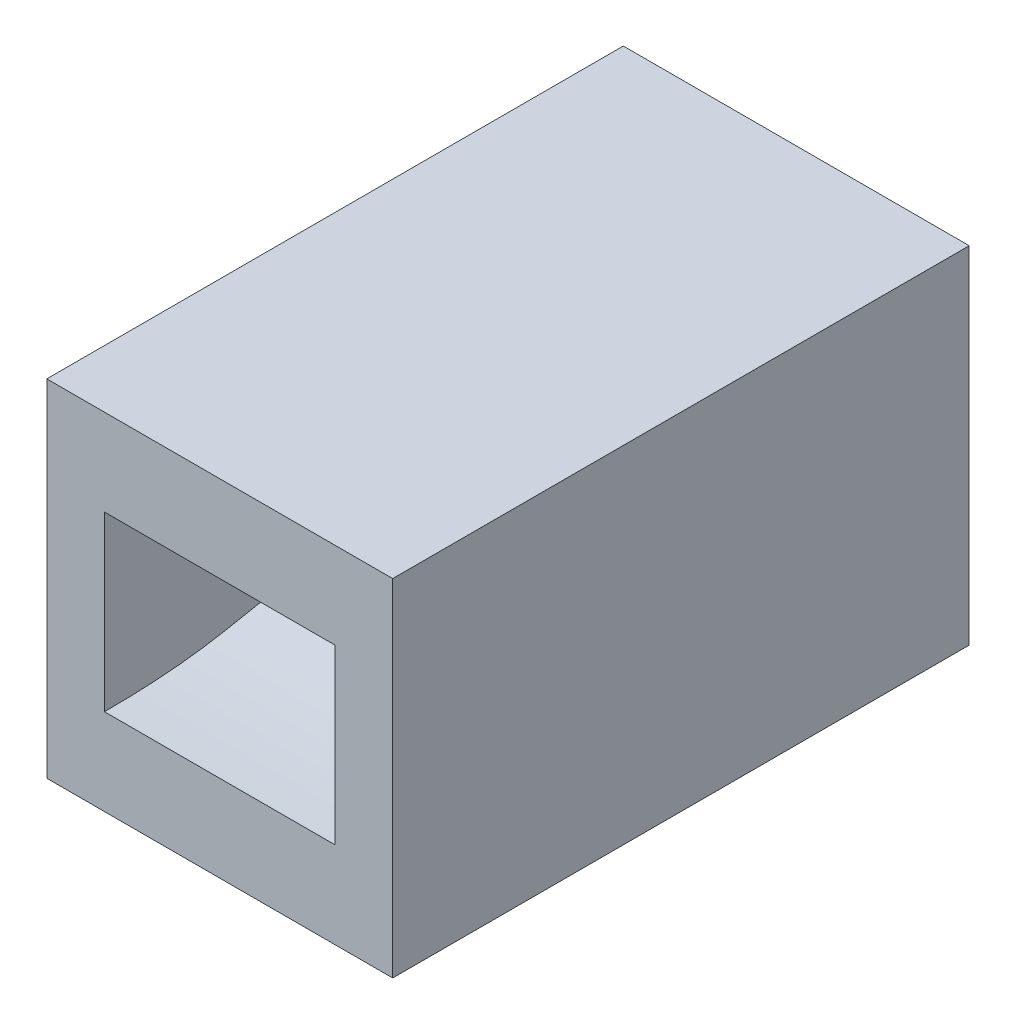
ISO-10303-21;
HEADER;
FILE_DESCRIPTION(('STEP AP214'),'2;1');
FILE_NAME('part.step','',(''),(''),'','','');
FILE_SCHEMA(('AUTOMOTIVE_DESIGN { 1 0 10303 214 1 1 1 1 }'));
ENDSEC;
DATA;
#1=APPLICATION_CONTEXT('core data for automotive mechanical design processes');
#2=APPLICATION_PROTOCOL_DEFINITION('international standard','automotive_design',2000,#1);
#3=PRODUCT_CONTEXT('',#1,'mechanical');
#4=PRODUCT('Part','Part','',(#3));
#5=PRODUCT_RELATED_PRODUCT_CATEGORY('part','',(#4));
#6=PRODUCT_DEFINITION_FORMATION('','',#4);
#7=PRODUCT_DEFINITION_CONTEXT('part definition',#1,'design');
#8=PRODUCT_DEFINITION('design','',#6,#7);
#9=PRODUCT_DEFINITION_SHAPE('','',#8);
#10=(LENGTH_UNIT() NAMED_UNIT(*) SI_UNIT(.MILLI.,.METRE.));
#11=(NAMED_UNIT(*) PLANE_ANGLE_UNIT() SI_UNIT($,.RADIAN.));
#12=(NAMED_UNIT(*) SI_UNIT($,.STERADIAN.) SOLID_ANGLE_UNIT());
#13=UNCERTAINTY_MEASURE_WITH_UNIT(LENGTH_MEASURE(1.E-05),#10,'distance_accuracy_value','');
#14=(GEOMETRIC_REPRESENTATION_CONTEXT(3) GLOBAL_UNCERTAINTY_ASSIGNED_CONTEXT((#13)) GLOBAL_UNIT_ASSIGNED_CONTEXT((#10,
#11,#12)) REPRESENTATION_CONTEXT('',''));
#15=CARTESIAN_POINT('',(0.,0.,0.));
#16=DIRECTION('',(0.,0.,1.));
#17=DIRECTION('',(1.,0.,0.));
#18=AXIS2_PLACEMENT_3D('',#15,#16,#17);
#19=CARTESIAN_POINT('',(30.,30.,0.));
#20=DIRECTION('',(0.,0.,1.));
#21=DIRECTION('',(0.,-1.,0.));
#22=AXIS2_PLACEMENT_3D('',#19,#20,#21);
#23=PLANE('',#22);
#24=DIRECTION('',(0.,1.,0.));
#25=VECTOR('',#24,1.);
#26=CARTESIAN_POINT('',(-30.,30.,0.));
#27=LINE('',#26,#25);
#28=CARTESIAN_POINT('',(-30.,-30.,0.));
#29=VERTEX_POINT('',#28);
#30=CARTESIAN_POINT('',(-30.,30.,0.));
#31=VERTEX_POINT('',#30);
#32=EDGE_CURVE('E210',#29,#31,#27,.T.);
#33=ORIENTED_EDGE('',*,*,#32,.T.);
#34=DIRECTION('',(-1.,0.,0.));
#35=VECTOR('',#34,1.);
#36=CARTESIAN_POINT('',(30.,30.,0.));
#37=LINE('',#36,#35);
#38=CARTESIAN_POINT('',(30.,30.,0.));
#39=VERTEX_POINT('',#38);
#40=EDGE_CURVE('E11',#39,#31,#37,.T.);
#41=ORIENTED_EDGE('',*,*,#40,.F.);
#42=DIRECTION('',(0.,1.,0.));
#43=VECTOR('',#42,1.);
#44=CARTESIAN_POINT('',(30.,30.,0.));
#45=LINE('',#44,#43);
#46=CARTESIAN_POINT('',(30.,-30.,0.));
#47=VERTEX_POINT('',#46);
#48=EDGE_CURVE('E213',#47,#39,#45,.T.);
#49=ORIENTED_EDGE('',*,*,#48,.F.);
#50=DIRECTION('',(-1.,0.,0.));
#51=VECTOR('',#50,1.);
#52=CARTESIAN_POINT('',(30.,-30.,0.));
#53=LINE('',#52,#51);
#54=EDGE_CURVE('E224',#47,#29,#53,.T.);
#55=ORIENTED_EDGE('',*,*,#54,.T.);
#56=EDGE_LOOP('',(#33,#41,#49,#55));
#57=FACE_BOUND('',#56,.T.);
#58=DIRECTION('',(0.,1.,0.));
#59=VECTOR('',#58,1.);
#60=CARTESIAN_POINT('',(-20.,15.,0.));
#61=LINE('',#60,#59);
#62=CARTESIAN_POINT('',(-20.,-15.,0.));
#63=VERTEX_POINT('',#62);
#64=CARTESIAN_POINT('',(-20.,15.,0.));
#65=VERTEX_POINT('',#64);
#66=EDGE_CURVE('E177',#63,#65,#61,.T.);
#67=ORIENTED_EDGE('',*,*,#66,.F.);
#68=DIRECTION('',(1.,0.,0.));
#69=VECTOR('',#68,1.);
#70=CARTESIAN_POINT('',(-20.,-15.,0.));
#71=LINE('',#70,#69);
#72=CARTESIAN_POINT('',(20.,-15.,0.));
#73=VERTEX_POINT('',#72);
#74=EDGE_CURVE('E209',#63,#73,#71,.T.);
#75=ORIENTED_EDGE('',*,*,#74,.T.);
#76=DIRECTION('',(0.,1.,0.));
#77=VECTOR('',#76,1.);
#78=CARTESIAN_POINT('',(20.,15.,0.));
#79=LINE('',#78,#77);
#80=CARTESIAN_POINT('',(20.,15.,0.));
#81=VERTEX_POINT('',#80);
#82=EDGE_CURVE('E197',#73,#81,#79,.T.);
#83=ORIENTED_EDGE('',*,*,#82,.T.);
#84=DIRECTION('',(1.,0.,0.));
#85=VECTOR('',#84,1.);
#86=CARTESIAN_POINT('',(-20.,15.,0.));
#87=LINE('',#86,#85);
#88=EDGE_CURVE('E204',#65,#81,#87,.T.);
#89=ORIENTED_EDGE('',*,*,#88,.F.);
#90=EDGE_LOOP('',(#67,#75,#83,#89));
#91=FACE_BOUND('',#90,.T.);
#92=ADVANCED_FACE('F39',(#57,#91),#23,.F.);
#93=CARTESIAN_POINT('',(30.,30.,0.));
#94=DIRECTION('',(0.,-1.,0.));
#95=DIRECTION('',(0.,0.,-1.));
#96=AXIS2_PLACEMENT_3D('',#93,#94,#95);
#97=PLANE('',#96);
#98=DIRECTION('',(0.,0.,1.));
#99=VECTOR('',#98,1.);
#100=CARTESIAN_POINT('',(-30.,30.,0.));
#101=LINE('',#100,#99);
#102=CARTESIAN_POINT('',(-30.,30.,100.));
#103=VERTEX_POINT('',#102);
#104=EDGE_CURVE('E230',#31,#103,#101,.T.);
#105=ORIENTED_EDGE('',*,*,#104,.T.);
#106=DIRECTION('',(-1.,0.,0.));
#107=VECTOR('',#106,1.);
#108=CARTESIAN_POINT('',(30.,30.,100.));
#109=LINE('',#108,#107);
#110=CARTESIAN_POINT('',(30.,30.,100.));
#111=VERTEX_POINT('',#110);
#112=EDGE_CURVE('E46',#111,#103,#109,.T.);
#113=ORIENTED_EDGE('',*,*,#112,.F.);
#114=DIRECTION('',(0.,0.,1.));
#115=VECTOR('',#114,1.);
#116=CARTESIAN_POINT('',(30.,30.,0.));
#117=LINE('',#116,#115);
#118=EDGE_CURVE('E219',#39,#111,#117,.T.);
#119=ORIENTED_EDGE('',*,*,#118,.F.);
#120=ORIENTED_EDGE('',*,*,#40,.T.);
#121=EDGE_LOOP('',(#105,#113,#119,#120));
#122=FACE_BOUND('',#121,.T.);
#123=ADVANCED_FACE('F257',(#122),#97,.F.);
#124=CARTESIAN_POINT('',(30.,30.,100.));
#125=DIRECTION('',(0.,0.,-1.));
#126=DIRECTION('',(-1.,0.,0.));
#127=AXIS2_PLACEMENT_3D('',#124,#125,#126);
#128=PLANE('',#127);
#129=DIRECTION('',(1.,0.,0.));
#130=VECTOR('',#129,1.);
#131=CARTESIAN_POINT('',(-20.,-15.,100.));
#132=LINE('',#131,#130);
#133=CARTESIAN_POINT('',(-20.,-15.,100.));
#134=VERTEX_POINT('',#133);
#135=CARTESIAN_POINT('',(20.,-15.,100.));
#136=VERTEX_POINT('',#135);
#137=EDGE_CURVE('E52',#134,#136,#132,.T.);
#138=ORIENTED_EDGE('',*,*,#137,.F.);
#139=DIRECTION('',(0.,1.,0.));
#140=VECTOR('',#139,1.);
#141=CARTESIAN_POINT('',(-20.,15.,100.));
#142=LINE('',#141,#140);
#143=CARTESIAN_POINT('',(-20.,15.,100.));
#144=VERTEX_POINT('',#143);
#145=EDGE_CURVE('E134',#134,#144,#142,.T.);
#146=ORIENTED_EDGE('',*,*,#145,.T.);
#147=DIRECTION('',(1.,0.,0.));
#148=VECTOR('',#147,1.);
#149=CARTESIAN_POINT('',(-20.,15.,100.));
#150=LINE('',#149,#148);
#151=CARTESIAN_POINT('',(20.,15.,100.));
#152=VERTEX_POINT('',#151);
#153=EDGE_CURVE('E120',#144,#152,#150,.T.);
#154=ORIENTED_EDGE('',*,*,#153,.T.);
#155=DIRECTION('',(0.,1.,0.));
#156=VECTOR('',#155,1.);
#157=CARTESIAN_POINT('',(20.,15.,100.));
#158=LINE('',#157,#156);
#159=EDGE_CURVE('E337',#136,#152,#158,.T.);
#160=ORIENTED_EDGE('',*,*,#159,.F.);
#161=EDGE_LOOP('',(#138,#146,#154,#160));
#162=FACE_BOUND('',#161,.T.);
#163=DIRECTION('',(0.,-1.,0.));
#164=VECTOR('',#163,1.);
#165=CARTESIAN_POINT('',(-30.,30.,100.));
#166=LINE('',#165,#164);
#167=CARTESIAN_POINT('',(-30.,-30.,100.));
#168=VERTEX_POINT('',#167);
#169=EDGE_CURVE('E227',#103,#168,#166,.T.);
#170=ORIENTED_EDGE('',*,*,#169,.T.);
#171=DIRECTION('',(-1.,0.,0.));
#172=VECTOR('',#171,1.);
#173=CARTESIAN_POINT('',(30.,-30.,100.));
#174=LINE('',#173,#172);
#175=CARTESIAN_POINT('',(30.,-30.,100.));
#176=VERTEX_POINT('',#175);
#177=EDGE_CURVE('E233',#176,#168,#174,.T.);
#178=ORIENTED_EDGE('',*,*,#177,.F.);
#179=DIRECTION('',(0.,-1.,0.));
#180=VECTOR('',#179,1.);
#181=CARTESIAN_POINT('',(30.,30.,100.));
#182=LINE('',#181,#180);
#183=EDGE_CURVE('E221',#111,#176,#182,.T.);
#184=ORIENTED_EDGE('',*,*,#183,.F.);
#185=ORIENTED_EDGE('',*,*,#112,.T.);
#186=EDGE_LOOP('',(#170,#178,#184,#185));
#187=FACE_BOUND('',#186,.T.);
#188=ADVANCED_FACE('F139',(#162,#187),#128,.F.);
#189=CARTESIAN_POINT('',(30.,-30.,0.));
#190=DIRECTION('',(0.,1.,0.));
#191=DIRECTION('',(0.,0.,1.));
#192=AXIS2_PLACEMENT_3D('',#189,#190,#191);
#193=PLANE('',#192);
#194=DIRECTION('',(0.,0.,-1.));
#195=VECTOR('',#194,1.);
#196=CARTESIAN_POINT('',(-30.,-30.,0.));
#197=LINE('',#196,#195);
#198=EDGE_CURVE('E218',#168,#29,#197,.T.);
#199=ORIENTED_EDGE('',*,*,#198,.T.);
#200=ORIENTED_EDGE('',*,*,#54,.F.);
#201=DIRECTION('',(0.,0.,-1.));
#202=VECTOR('',#201,1.);
#203=CARTESIAN_POINT('',(30.,-30.,0.));
#204=LINE('',#203,#202);
#205=EDGE_CURVE('E223',#176,#47,#204,.T.);
#206=ORIENTED_EDGE('',*,*,#205,.F.);
#207=ORIENTED_EDGE('',*,*,#177,.T.);
#208=EDGE_LOOP('',(#199,#200,#206,#207));
#209=FACE_BOUND('',#208,.T.);
#210=ADVANCED_FACE('F247',(#209),#193,.F.);
#211=CARTESIAN_POINT('',(30.,0.,0.));
#212=DIRECTION('',(-1.,0.,0.));
#213=DIRECTION('',(0.,0.,1.));
#214=AXIS2_PLACEMENT_3D('',#211,#212,#213);
#215=PLANE('',#214);
#216=ORIENTED_EDGE('',*,*,#48,.T.);
#217=ORIENTED_EDGE('',*,*,#118,.T.);
#218=ORIENTED_EDGE('',*,*,#183,.T.);
#219=ORIENTED_EDGE('',*,*,#205,.T.);
#220=EDGE_LOOP('',(#216,#217,#218,#219));
#221=FACE_BOUND('',#220,.T.);
#222=ADVANCED_FACE('F258',(#221),#215,.F.);
#223=CARTESIAN_POINT('',(-30.,0.,0.));
#224=DIRECTION('',(-1.,0.,0.));
#225=DIRECTION('',(0.,0.,1.));
#226=AXIS2_PLACEMENT_3D('',#223,#224,#225);
#227=PLANE('',#226);
#228=ORIENTED_EDGE('',*,*,#32,.F.);
#229=ORIENTED_EDGE('',*,*,#198,.F.);
#230=ORIENTED_EDGE('',*,*,#169,.F.);
#231=ORIENTED_EDGE('',*,*,#104,.F.);
#232=EDGE_LOOP('',(#228,#229,#230,#231));
#233=FACE_BOUND('',#232,.T.);
#234=ADVANCED_FACE('F246',(#233),#227,.T.);
#235=CARTESIAN_POINT('',(-20.,15.,0.));
#236=CARTESIAN_POINT('',(-20.,15.,25.));
#237=CARTESIAN_POINT('',(-20.,20.,25.));
#238=CARTESIAN_POINT('',(-20.,20.,50.));
#239=B_SPLINE_CURVE_WITH_KNOTS('',3,(#235,#236,#237,#238),.UNSPECIFIED.,.F.,.F.,(4,4),(0.,1.),.UNSPECIFIED.);
#240=DIRECTION('',(1.,0.,0.));
#241=VECTOR('',#240,1.);
#242=SURFACE_OF_LINEAR_EXTRUSION('',#239,#241);
#243=CARTESIAN_POINT('',(20.,15.,0.));
#244=CARTESIAN_POINT('',(20.,15.,25.));
#245=CARTESIAN_POINT('',(20.,20.,25.));
#246=CARTESIAN_POINT('',(20.,20.,50.));
#247=B_SPLINE_CURVE_WITH_KNOTS('',3,(#243,#244,#245,#246),.UNSPECIFIED.,.F.,.F.,(4,4),(0.,1.),.UNSPECIFIED.);
#248=CARTESIAN_POINT('',(20.,20.,50.));
#249=VERTEX_POINT('',#248);
#250=EDGE_CURVE('E62',#81,#249,#247,.T.);
#251=ORIENTED_EDGE('',*,*,#250,.T.);
#252=DIRECTION('',(1.,0.,0.));
#253=VECTOR('',#252,1.);
#254=CARTESIAN_POINT('',(-20.,20.,50.));
#255=LINE('',#254,#253);
#256=CARTESIAN_POINT('',(-20.,20.,50.));
#257=VERTEX_POINT('',#256);
#258=EDGE_CURVE('E186',#257,#249,#255,.T.);
#259=ORIENTED_EDGE('',*,*,#258,.F.);
#260=EDGE_CURVE('E133',#65,#257,#239,.T.);
#261=ORIENTED_EDGE('',*,*,#260,.F.);
#262=ORIENTED_EDGE('',*,*,#88,.T.);
#263=EDGE_LOOP('',(#251,#259,#261,#262));
#264=FACE_BOUND('',#263,.T.);
#265=ADVANCED_FACE('F170',(#264),#242,.F.);
#266=CARTESIAN_POINT('',(-20.,-10.,50.));
#267=CARTESIAN_POINT('',(-20.,-10.,25.));
#268=CARTESIAN_POINT('',(-20.,-15.,25.));
#269=CARTESIAN_POINT('',(-20.,-15.,0.));
#270=B_SPLINE_CURVE_WITH_KNOTS('',3,(#266,#267,#268,#269),.UNSPECIFIED.,.F.,.F.,(4,4),(0.,1.),.UNSPECIFIED.);
#271=DIRECTION('',(1.,0.,0.));
#272=VECTOR('',#271,1.);
#273=SURFACE_OF_LINEAR_EXTRUSION('',#270,#272);
#274=CARTESIAN_POINT('',(20.,-10.,50.));
#275=CARTESIAN_POINT('',(20.,-10.,25.));
#276=CARTESIAN_POINT('',(20.,-15.,25.));
#277=CARTESIAN_POINT('',(20.,-15.,0.));
#278=B_SPLINE_CURVE_WITH_KNOTS('',3,(#274,#275,#276,#277),.UNSPECIFIED.,.F.,.F.,(4,4),(0.,1.),.UNSPECIFIED.);
#279=CARTESIAN_POINT('',(20.,-10.,50.));
#280=VERTEX_POINT('',#279);
#281=EDGE_CURVE('E195',#280,#73,#278,.T.);
#282=ORIENTED_EDGE('',*,*,#281,.T.);
#283=ORIENTED_EDGE('',*,*,#74,.F.);
#284=CARTESIAN_POINT('',(-20.,-10.,50.));
#285=VERTEX_POINT('',#284);
#286=EDGE_CURVE('E172',#285,#63,#270,.T.);
#287=ORIENTED_EDGE('',*,*,#286,.F.);
#288=DIRECTION('',(1.,0.,0.));
#289=VECTOR('',#288,1.);
#290=CARTESIAN_POINT('',(-20.,-10.,50.));
#291=LINE('',#290,#289);
#292=EDGE_CURVE('E212',#285,#280,#291,.T.);
#293=ORIENTED_EDGE('',*,*,#292,.T.);
#294=EDGE_LOOP('',(#282,#283,#287,#293));
#295=FACE_BOUND('',#294,.T.);
#296=ADVANCED_FACE('F161',(#295),#273,.F.);
#297=CARTESIAN_POINT('',(-20.,17.5,25.));
#298=DIRECTION('',(1.,0.,0.));
#299=DIRECTION('',(0.,0.,-1.));
#300=AXIS2_PLACEMENT_3D('',#297,#298,#299);
#301=PLANE('',#300);
#302=ORIENTED_EDGE('',*,*,#260,.T.);
#303=CARTESIAN_POINT('',(-20.,15.,100.));
#304=CARTESIAN_POINT('',(-20.,15.,75.));
#305=CARTESIAN_POINT('',(-20.,20.,75.));
#306=CARTESIAN_POINT('',(-20.,20.,50.));
#307=B_SPLINE_CURVE_WITH_KNOTS('',3,(#303,#304,#305,#306),.UNSPECIFIED.,.F.,.F.,(4,4),(0.,1.),.UNSPECIFIED.);
#308=EDGE_CURVE('E119',#144,#257,#307,.T.);
#309=ORIENTED_EDGE('',*,*,#308,.F.);
#310=ORIENTED_EDGE('',*,*,#145,.F.);
#311=CARTESIAN_POINT('',(-20.,-10.,50.));
#312=CARTESIAN_POINT('',(-20.,-10.,75.));
#313=CARTESIAN_POINT('',(-20.,-15.,75.));
#314=CARTESIAN_POINT('',(-20.,-15.,100.));
#315=B_SPLINE_CURVE_WITH_KNOTS('',3,(#311,#312,#313,#314),.UNSPECIFIED.,.F.,.F.,(4,4),(0.,1.),.UNSPECIFIED.);
#316=EDGE_CURVE('E126',#285,#134,#315,.T.);
#317=ORIENTED_EDGE('',*,*,#316,.F.);
#318=ORIENTED_EDGE('',*,*,#286,.T.);
#319=ORIENTED_EDGE('',*,*,#66,.T.);
#320=EDGE_LOOP('',(#302,#309,#310,#317,#318,#319));
#321=FACE_BOUND('',#320,.T.);
#322=ADVANCED_FACE('F132',(#321),#301,.T.);
#323=CARTESIAN_POINT('',(20.,17.5,25.));
#324=DIRECTION('',(1.,0.,0.));
#325=DIRECTION('',(0.,0.,-1.));
#326=AXIS2_PLACEMENT_3D('',#323,#324,#325);
#327=PLANE('',#326);
#328=ORIENTED_EDGE('',*,*,#250,.F.);
#329=ORIENTED_EDGE('',*,*,#82,.F.);
#330=ORIENTED_EDGE('',*,*,#281,.F.);
#331=CARTESIAN_POINT('',(20.,-10.,50.));
#332=CARTESIAN_POINT('',(20.,-10.,75.));
#333=CARTESIAN_POINT('',(20.,-15.,75.));
#334=CARTESIAN_POINT('',(20.,-15.,100.));
#335=B_SPLINE_CURVE_WITH_KNOTS('',3,(#331,#332,#333,#334),.UNSPECIFIED.,.F.,.F.,(4,4),(0.,1.),.UNSPECIFIED.);
#336=EDGE_CURVE('E137',#280,#136,#335,.T.);
#337=ORIENTED_EDGE('',*,*,#336,.T.);
#338=ORIENTED_EDGE('',*,*,#159,.T.);
#339=CARTESIAN_POINT('',(20.,15.,100.));
#340=CARTESIAN_POINT('',(20.,15.,75.));
#341=CARTESIAN_POINT('',(20.,20.,75.));
#342=CARTESIAN_POINT('',(20.,20.,50.));
#343=B_SPLINE_CURVE_WITH_KNOTS('',3,(#339,#340,#341,#342),.UNSPECIFIED.,.F.,.F.,(4,4),(0.,1.),.UNSPECIFIED.);
#344=EDGE_CURVE('E125',#152,#249,#343,.T.);
#345=ORIENTED_EDGE('',*,*,#344,.T.);
#346=EDGE_LOOP('',(#328,#329,#330,#337,#338,#345));
#347=FACE_BOUND('',#346,.T.);
#348=ADVANCED_FACE('F162',(#347),#327,.F.);
#349=DIRECTION('',(1.,0.,0.));
#350=VECTOR('',#349,1.);
#351=SURFACE_OF_LINEAR_EXTRUSION('',#307,#350);
#352=ORIENTED_EDGE('',*,*,#344,.F.);
#353=ORIENTED_EDGE('',*,*,#153,.F.);
#354=ORIENTED_EDGE('',*,*,#308,.T.);
#355=ORIENTED_EDGE('',*,*,#258,.T.);
#356=EDGE_LOOP('',(#352,#353,#354,#355));
#357=FACE_BOUND('',#356,.T.);
#358=ADVANCED_FACE('F117',(#357),#351,.T.);
#359=DIRECTION('',(1.,0.,0.));
#360=VECTOR('',#359,1.);
#361=SURFACE_OF_LINEAR_EXTRUSION('',#315,#360);
#362=ORIENTED_EDGE('',*,*,#336,.F.);
#363=ORIENTED_EDGE('',*,*,#292,.F.);
#364=ORIENTED_EDGE('',*,*,#316,.T.);
#365=ORIENTED_EDGE('',*,*,#137,.T.);
#366=EDGE_LOOP('',(#362,#363,#364,#365));
#367=FACE_BOUND('',#366,.T.);
#368=ADVANCED_FACE('F157',(#367),#361,.T.);
#369=CLOSED_SHELL('',(#92,#123,#188,#210,#222,#234,#265,#296,#322,#348,#358,#368));
#370=MANIFOLD_SOLID_BREP('B2',#369);
#371=ADVANCED_BREP_SHAPE_REPRESENTATION('',(#18,#370),#14);
#372=SHAPE_DEFINITION_REPRESENTATION(#9,#371);
ENDSEC;
END-ISO-10303-21;
